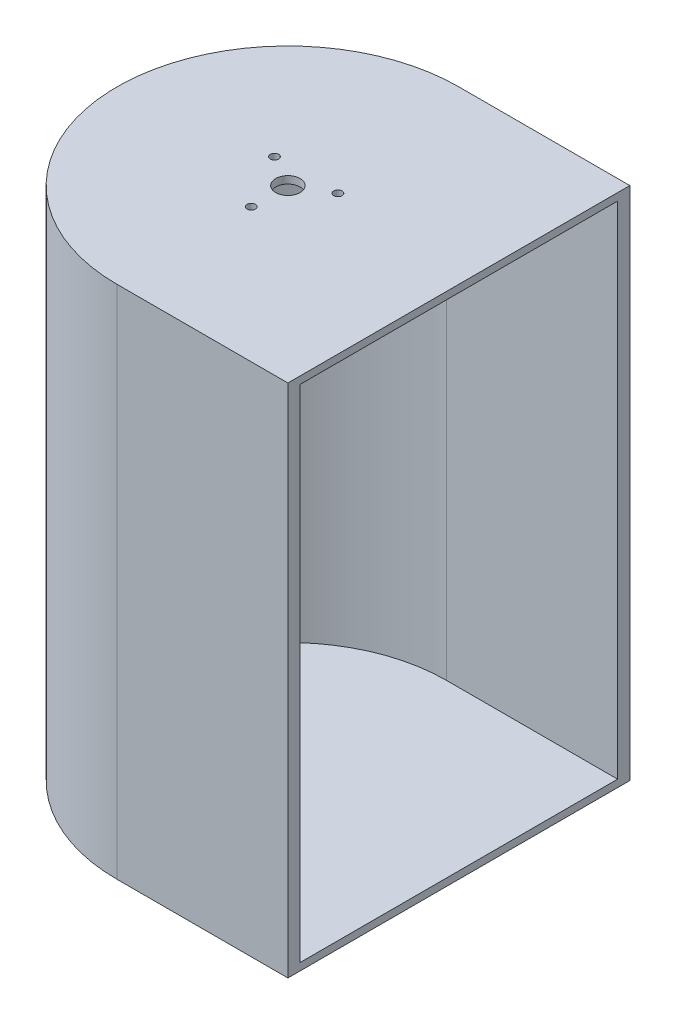
ISO-10303-21;
HEADER;
FILE_DESCRIPTION(('STEP AP214'),'2;1');
FILE_NAME('part.step','',(''),(''),'','','');
FILE_SCHEMA(('AUTOMOTIVE_DESIGN { 1 0 10303 214 1 1 1 1 }'));
ENDSEC;
DATA;
#1=APPLICATION_CONTEXT('core data for automotive mechanical design processes');
#2=APPLICATION_PROTOCOL_DEFINITION('international standard','automotive_design',2000,#1);
#3=PRODUCT_CONTEXT('',#1,'mechanical');
#4=PRODUCT('Part','Part','',(#3));
#5=PRODUCT_RELATED_PRODUCT_CATEGORY('part','',(#4));
#6=PRODUCT_DEFINITION_FORMATION('','',#4);
#7=PRODUCT_DEFINITION_CONTEXT('part definition',#1,'design');
#8=PRODUCT_DEFINITION('design','',#6,#7);
#9=PRODUCT_DEFINITION_SHAPE('','',#8);
#10=(LENGTH_UNIT() NAMED_UNIT(*) SI_UNIT(.MILLI.,.METRE.));
#11=(NAMED_UNIT(*) PLANE_ANGLE_UNIT() SI_UNIT($,.RADIAN.));
#12=(NAMED_UNIT(*) SI_UNIT($,.STERADIAN.) SOLID_ANGLE_UNIT());
#13=UNCERTAINTY_MEASURE_WITH_UNIT(LENGTH_MEASURE(1.E-05),#10,'distance_accuracy_value','');
#14=(GEOMETRIC_REPRESENTATION_CONTEXT(3) GLOBAL_UNCERTAINTY_ASSIGNED_CONTEXT((#13)) GLOBAL_UNIT_ASSIGNED_CONTEXT((#10,
#11,#12)) REPRESENTATION_CONTEXT('',''));
#15=CARTESIAN_POINT('',(0.,0.,0.));
#16=DIRECTION('',(0.,0.,1.));
#17=DIRECTION('',(1.,0.,0.));
#18=AXIS2_PLACEMENT_3D('',#15,#16,#17);
#19=CARTESIAN_POINT('',(0.,0.,0.));
#20=DIRECTION('',(0.,1.,0.));
#21=DIRECTION('',(0.,0.,1.));
#22=AXIS2_PLACEMENT_3D('',#19,#20,#21);
#23=PLANE('',#22);
#24=CARTESIAN_POINT('',(0.,0.,0.));
#25=DIRECTION('',(0.,1.,0.));
#26=DIRECTION('',(0.,0.,1.));
#27=AXIS2_PLACEMENT_3D('',#24,#25,#26);
#28=CIRCLE('',#27,5.);
#29=CARTESIAN_POINT('',(0.,0.,5.));
#30=VERTEX_POINT('',#29);
#31=EDGE_CURVE('E183',#30,#30,#28,.T.);
#32=ORIENTED_EDGE('',*,*,#31,.T.);
#33=EDGE_LOOP('',(#32));
#34=FACE_BOUND('',#33,.T.);
#35=CARTESIAN_POINT('',(0.,0.,15.));
#36=DIRECTION('',(0.,1.,0.));
#37=DIRECTION('',(0.,0.,1.));
#38=AXIS2_PLACEMENT_3D('',#35,#36,#37);
#39=CIRCLE('',#38,1.69999999999999);
#40=CARTESIAN_POINT('',(0.,0.,16.7));
#41=VERTEX_POINT('',#40);
#42=EDGE_CURVE('E177',#41,#41,#39,.F.);
#43=ORIENTED_EDGE('',*,*,#42,.F.);
#44=EDGE_LOOP('',(#43));
#45=FACE_BOUND('',#44,.T.);
#46=CARTESIAN_POINT('',(-12.9903810567675,0.,-7.49999999999945));
#47=DIRECTION('',(0.,1.,0.));
#48=DIRECTION('',(0.,0.,1.));
#49=AXIS2_PLACEMENT_3D('',#46,#47,#48);
#50=CIRCLE('',#49,1.69999999999999);
#51=CARTESIAN_POINT('',(-12.9903810567675,0.,-5.79999999999946));
#52=VERTEX_POINT('',#51);
#53=EDGE_CURVE('E171',#52,#52,#50,.F.);
#54=ORIENTED_EDGE('',*,*,#53,.F.);
#55=EDGE_LOOP('',(#54));
#56=FACE_BOUND('',#55,.T.);
#57=DIRECTION('',(0.,0.,1.));
#58=VECTOR('',#57,1.);
#59=CARTESIAN_POINT('',(70.,0.,65.));
#60=LINE('',#59,#58);
#61=CARTESIAN_POINT('',(70.,0.,-65.));
#62=VERTEX_POINT('',#61);
#63=CARTESIAN_POINT('',(70.,0.,65.));
#64=VERTEX_POINT('',#63);
#65=EDGE_CURVE('E56',#62,#64,#60,.T.);
#66=ORIENTED_EDGE('',*,*,#65,.T.);
#67=DIRECTION('',(-1.,0.,0.));
#68=VECTOR('',#67,1.);
#69=CARTESIAN_POINT('',(70.,0.,65.));
#70=LINE('',#69,#68);
#71=CARTESIAN_POINT('',(0.,0.,65.));
#72=VERTEX_POINT('',#71);
#73=EDGE_CURVE('E145',#64,#72,#70,.T.);
#74=ORIENTED_EDGE('',*,*,#73,.T.);
#75=CARTESIAN_POINT('',(0.,0.,0.));
#76=DIRECTION('',(0.,-1.,0.));
#77=DIRECTION('',(0.,0.,-1.));
#78=AXIS2_PLACEMENT_3D('',#75,#76,#77);
#79=CIRCLE('',#78,65.);
#80=CARTESIAN_POINT('',(0.,0.,-65.));
#81=VERTEX_POINT('',#80);
#82=EDGE_CURVE('E162',#72,#81,#79,.T.);
#83=ORIENTED_EDGE('',*,*,#82,.T.);
#84=DIRECTION('',(-1.,0.,0.));
#85=VECTOR('',#84,1.);
#86=CARTESIAN_POINT('',(70.,0.,-65.));
#87=LINE('',#86,#85);
#88=EDGE_CURVE('E148',#62,#81,#87,.T.);
#89=ORIENTED_EDGE('',*,*,#88,.F.);
#90=EDGE_LOOP('',(#66,#74,#83,#89));
#91=FACE_BOUND('',#90,.T.);
#92=CARTESIAN_POINT('',(12.9903810567656,0.,-7.50000000000055));
#93=DIRECTION('',(0.,1.,0.));
#94=DIRECTION('',(0.,0.,1.));
#95=AXIS2_PLACEMENT_3D('',#92,#93,#94);
#96=CIRCLE('',#95,1.69999999999999);
#97=CARTESIAN_POINT('',(12.9903810567656,0.,-5.80000000000056));
#98=VERTEX_POINT('',#97);
#99=EDGE_CURVE('E121',#98,#98,#96,.F.);
#100=ORIENTED_EDGE('',*,*,#99,.F.);
#101=EDGE_LOOP('',(#100));
#102=FACE_BOUND('',#101,.T.);
#103=ADVANCED_FACE('F39',(#34,#45,#56,#91,#102),#23,.F.);
#104=CARTESIAN_POINT('',(70.,0.,0.));
#105=DIRECTION('',(1.,0.,0.));
#106=DIRECTION('',(0.,0.,-1.));
#107=AXIS2_PLACEMENT_3D('',#104,#105,#106);
#108=PLANE('',#107);
#109=DIRECTION('',(0.,0.,-1.));
#110=VECTOR('',#109,1.);
#111=CARTESIAN_POINT('',(70.,-205.,-65.));
#112=LINE('',#111,#110);
#113=CARTESIAN_POINT('',(70.,-205.,65.));
#114=VERTEX_POINT('',#113);
#115=CARTESIAN_POINT('',(70.,-205.,-65.));
#116=VERTEX_POINT('',#115);
#117=EDGE_CURVE('E11',#114,#116,#112,.T.);
#118=ORIENTED_EDGE('',*,*,#117,.F.);
#119=DIRECTION('',(0.,-1.,0.));
#120=VECTOR('',#119,1.);
#121=CARTESIAN_POINT('',(70.,0.,65.));
#122=LINE('',#121,#120);
#123=EDGE_CURVE('E137',#64,#114,#122,.T.);
#124=ORIENTED_EDGE('',*,*,#123,.F.);
#125=ORIENTED_EDGE('',*,*,#65,.F.);
#126=DIRECTION('',(0.,1.,0.));
#127=VECTOR('',#126,1.);
#128=CARTESIAN_POINT('',(70.,-205.,-65.));
#129=LINE('',#128,#127);
#130=EDGE_CURVE('E48',#116,#62,#129,.T.);
#131=ORIENTED_EDGE('',*,*,#130,.F.);
#132=EDGE_LOOP('',(#118,#124,#125,#131));
#133=FACE_BOUND('',#132,.T.);
#134=DIRECTION('',(0.,0.,1.));
#135=VECTOR('',#134,1.);
#136=CARTESIAN_POINT('',(70.,-208.,0.));
#137=LINE('',#136,#135);
#138=CARTESIAN_POINT('',(70.,-208.,-70.));
#139=VERTEX_POINT('',#138);
#140=CARTESIAN_POINT('',(70.,-208.,70.));
#141=VERTEX_POINT('',#140);
#142=EDGE_CURVE('E104',#139,#141,#137,.T.);
#143=ORIENTED_EDGE('',*,*,#142,.F.);
#144=DIRECTION('',(0.,1.,0.));
#145=VECTOR('',#144,1.);
#146=CARTESIAN_POINT('',(70.,-208.,-70.));
#147=LINE('',#146,#145);
#148=CARTESIAN_POINT('',(70.,3.,-70.));
#149=VERTEX_POINT('',#148);
#150=EDGE_CURVE('E114',#139,#149,#147,.T.);
#151=ORIENTED_EDGE('',*,*,#150,.T.);
#152=DIRECTION('',(0.,0.,-1.));
#153=VECTOR('',#152,1.);
#154=CARTESIAN_POINT('',(70.,3.,0.));
#155=LINE('',#154,#153);
#156=CARTESIAN_POINT('',(70.,3.,70.));
#157=VERTEX_POINT('',#156);
#158=EDGE_CURVE('E113',#157,#149,#155,.T.);
#159=ORIENTED_EDGE('',*,*,#158,.F.);
#160=DIRECTION('',(0.,-1.,0.));
#161=VECTOR('',#160,1.);
#162=CARTESIAN_POINT('',(70.,3.,70.));
#163=LINE('',#162,#161);
#164=EDGE_CURVE('E117',#157,#141,#163,.T.);
#165=ORIENTED_EDGE('',*,*,#164,.T.);
#166=EDGE_LOOP('',(#143,#151,#159,#165));
#167=FACE_BOUND('',#166,.T.);
#168=ADVANCED_FACE('F118',(#133,#167),#108,.T.);
#169=CARTESIAN_POINT('',(0.,3.,0.));
#170=DIRECTION('',(0.,-1.,0.));
#171=DIRECTION('',(0.,0.,-1.));
#172=AXIS2_PLACEMENT_3D('',#169,#170,#171);
#173=CYLINDRICAL_SURFACE('',#172,70.);
#174=DIRECTION('',(0.,-1.,0.));
#175=VECTOR('',#174,1.);
#176=CARTESIAN_POINT('',(0.,3.,70.));
#177=LINE('',#176,#175);
#178=CARTESIAN_POINT('',(0.,3.,70.));
#179=VERTEX_POINT('',#178);
#180=CARTESIAN_POINT('',(0.,-208.,70.));
#181=VERTEX_POINT('',#180);
#182=EDGE_CURVE('E125',#179,#181,#177,.T.);
#183=ORIENTED_EDGE('',*,*,#182,.F.);
#184=CARTESIAN_POINT('',(0.,3.,0.));
#185=DIRECTION('',(0.,1.,0.));
#186=DIRECTION('',(0.,0.,1.));
#187=AXIS2_PLACEMENT_3D('',#184,#185,#186);
#188=CIRCLE('',#187,70.);
#189=CARTESIAN_POINT('',(0.,3.,-70.));
#190=VERTEX_POINT('',#189);
#191=EDGE_CURVE('E155',#190,#179,#188,.T.);
#192=ORIENTED_EDGE('',*,*,#191,.F.);
#193=DIRECTION('',(0.,-1.,0.));
#194=VECTOR('',#193,1.);
#195=CARTESIAN_POINT('',(0.,3.,-70.));
#196=LINE('',#195,#194);
#197=CARTESIAN_POINT('',(0.,-208.,-70.));
#198=VERTEX_POINT('',#197);
#199=EDGE_CURVE('E132',#198,#190,#196,.F.);
#200=ORIENTED_EDGE('',*,*,#199,.F.);
#201=CARTESIAN_POINT('',(0.,-208.,0.));
#202=DIRECTION('',(0.,-1.,0.));
#203=DIRECTION('',(0.,0.,-1.));
#204=AXIS2_PLACEMENT_3D('',#201,#202,#203);
#205=CIRCLE('',#204,70.);
#206=EDGE_CURVE('E136',#181,#198,#205,.T.);
#207=ORIENTED_EDGE('',*,*,#206,.F.);
#208=EDGE_LOOP('',(#183,#192,#200,#207));
#209=FACE_BOUND('',#208,.T.);
#210=ADVANCED_FACE('F206',(#209),#173,.T.);
#211=CARTESIAN_POINT('',(70.,-208.,-70.));
#212=DIRECTION('',(0.,0.,1.));
#213=DIRECTION('',(1.,0.,0.));
#214=AXIS2_PLACEMENT_3D('',#211,#212,#213);
#215=PLANE('',#214);
#216=ORIENTED_EDGE('',*,*,#150,.F.);
#217=DIRECTION('',(-1.,0.,0.));
#218=VECTOR('',#217,1.);
#219=CARTESIAN_POINT('',(70.,-208.,-70.));
#220=LINE('',#219,#218);
#221=EDGE_CURVE('E43',#139,#198,#220,.T.);
#222=ORIENTED_EDGE('',*,*,#221,.T.);
#223=ORIENTED_EDGE('',*,*,#199,.T.);
#224=DIRECTION('',(-1.,0.,0.));
#225=VECTOR('',#224,1.);
#226=CARTESIAN_POINT('',(70.,3.,-70.));
#227=LINE('',#226,#225);
#228=EDGE_CURVE('E129',#149,#190,#227,.T.);
#229=ORIENTED_EDGE('',*,*,#228,.F.);
#230=EDGE_LOOP('',(#216,#222,#223,#229));
#231=FACE_BOUND('',#230,.T.);
#232=ADVANCED_FACE('F210',(#231),#215,.F.);
#233=CARTESIAN_POINT('',(70.,3.,70.));
#234=DIRECTION('',(0.,0.,-1.));
#235=DIRECTION('',(-1.,0.,0.));
#236=AXIS2_PLACEMENT_3D('',#233,#234,#235);
#237=PLANE('',#236);
#238=ORIENTED_EDGE('',*,*,#164,.F.);
#239=DIRECTION('',(-1.,0.,0.));
#240=VECTOR('',#239,1.);
#241=CARTESIAN_POINT('',(70.,3.,70.));
#242=LINE('',#241,#240);
#243=EDGE_CURVE('E127',#157,#179,#242,.T.);
#244=ORIENTED_EDGE('',*,*,#243,.T.);
#245=ORIENTED_EDGE('',*,*,#182,.T.);
#246=DIRECTION('',(-1.,0.,0.));
#247=VECTOR('',#246,1.);
#248=CARTESIAN_POINT('',(70.,-208.,70.));
#249=LINE('',#248,#247);
#250=EDGE_CURVE('E108',#141,#181,#249,.T.);
#251=ORIENTED_EDGE('',*,*,#250,.F.);
#252=EDGE_LOOP('',(#238,#244,#245,#251));
#253=FACE_BOUND('',#252,.T.);
#254=ADVANCED_FACE('F123',(#253),#237,.F.);
#255=CARTESIAN_POINT('',(0.,3.,0.));
#256=DIRECTION('',(0.,1.,0.));
#257=DIRECTION('',(0.,0.,1.));
#258=AXIS2_PLACEMENT_3D('',#255,#256,#257);
#259=PLANE('',#258);
#260=CARTESIAN_POINT('',(0.,3.,0.));
#261=DIRECTION('',(0.,1.,0.));
#262=DIRECTION('',(0.,0.,1.));
#263=AXIS2_PLACEMENT_3D('',#260,#261,#262);
#264=CIRCLE('',#263,5.);
#265=CARTESIAN_POINT('',(0.,3.,5.));
#266=VERTEX_POINT('',#265);
#267=EDGE_CURVE('E188',#266,#266,#264,.T.);
#268=ORIENTED_EDGE('',*,*,#267,.F.);
#269=EDGE_LOOP('',(#268));
#270=FACE_BOUND('',#269,.T.);
#271=CARTESIAN_POINT('',(0.,3.,15.));
#272=DIRECTION('',(0.,1.,0.));
#273=DIRECTION('',(0.,0.,1.));
#274=AXIS2_PLACEMENT_3D('',#271,#272,#273);
#275=CIRCLE('',#274,1.69999999999999);
#276=CARTESIAN_POINT('',(0.,3.,16.7));
#277=VERTEX_POINT('',#276);
#278=EDGE_CURVE('E180',#277,#277,#275,.T.);
#279=ORIENTED_EDGE('',*,*,#278,.F.);
#280=EDGE_LOOP('',(#279));
#281=FACE_BOUND('',#280,.T.);
#282=CARTESIAN_POINT('',(-12.9903810567675,3.,-7.49999999999945));
#283=DIRECTION('',(0.,1.,0.));
#284=DIRECTION('',(0.,0.,1.));
#285=AXIS2_PLACEMENT_3D('',#282,#283,#284);
#286=CIRCLE('',#285,1.69999999999999);
#287=CARTESIAN_POINT('',(-12.9903810567675,3.,-5.79999999999946));
#288=VERTEX_POINT('',#287);
#289=EDGE_CURVE('E174',#288,#288,#286,.T.);
#290=ORIENTED_EDGE('',*,*,#289,.F.);
#291=EDGE_LOOP('',(#290));
#292=FACE_BOUND('',#291,.T.);
#293=CARTESIAN_POINT('',(12.9903810567656,3.,-7.50000000000055));
#294=DIRECTION('',(0.,1.,0.));
#295=DIRECTION('',(0.,0.,1.));
#296=AXIS2_PLACEMENT_3D('',#293,#294,#295);
#297=CIRCLE('',#296,1.69999999999999);
#298=CARTESIAN_POINT('',(12.9903810567656,3.,-5.80000000000056));
#299=VERTEX_POINT('',#298);
#300=EDGE_CURVE('E168',#299,#299,#297,.T.);
#301=ORIENTED_EDGE('',*,*,#300,.F.);
#302=EDGE_LOOP('',(#301));
#303=FACE_BOUND('',#302,.T.);
#304=ORIENTED_EDGE('',*,*,#243,.F.);
#305=ORIENTED_EDGE('',*,*,#158,.T.);
#306=ORIENTED_EDGE('',*,*,#228,.T.);
#307=ORIENTED_EDGE('',*,*,#191,.T.);
#308=EDGE_LOOP('',(#304,#305,#306,#307));
#309=FACE_BOUND('',#308,.T.);
#310=ADVANCED_FACE('F195',(#270,#281,#292,#303,#309),#259,.T.);
#311=CARTESIAN_POINT('',(0.,-208.,0.));
#312=DIRECTION('',(0.,-1.,0.));
#313=DIRECTION('',(0.,0.,-1.));
#314=AXIS2_PLACEMENT_3D('',#311,#312,#313);
#315=PLANE('',#314);
#316=ORIENTED_EDGE('',*,*,#221,.F.);
#317=ORIENTED_EDGE('',*,*,#142,.T.);
#318=ORIENTED_EDGE('',*,*,#250,.T.);
#319=ORIENTED_EDGE('',*,*,#206,.T.);
#320=EDGE_LOOP('',(#316,#317,#318,#319));
#321=FACE_BOUND('',#320,.T.);
#322=ADVANCED_FACE('F41',(#321),#315,.T.);
#323=CARTESIAN_POINT('',(0.,-205.,0.));
#324=DIRECTION('',(0.,-1.,0.));
#325=DIRECTION('',(0.,0.,-1.));
#326=AXIS2_PLACEMENT_3D('',#323,#324,#325);
#327=PLANE('',#326);
#328=ORIENTED_EDGE('',*,*,#117,.T.);
#329=DIRECTION('',(-1.,0.,0.));
#330=VECTOR('',#329,1.);
#331=CARTESIAN_POINT('',(70.,-205.,-65.));
#332=LINE('',#331,#330);
#333=CARTESIAN_POINT('',(0.,-205.,-65.));
#334=VERTEX_POINT('',#333);
#335=EDGE_CURVE('E128',#116,#334,#332,.T.);
#336=ORIENTED_EDGE('',*,*,#335,.T.);
#337=CARTESIAN_POINT('',(0.,-205.,0.));
#338=DIRECTION('',(0.,-1.,0.));
#339=DIRECTION('',(0.,0.,-1.));
#340=AXIS2_PLACEMENT_3D('',#337,#338,#339);
#341=CIRCLE('',#340,65.);
#342=CARTESIAN_POINT('',(0.,-205.,65.));
#343=VERTEX_POINT('',#342);
#344=EDGE_CURVE('E165',#343,#334,#341,.T.);
#345=ORIENTED_EDGE('',*,*,#344,.F.);
#346=DIRECTION('',(-1.,0.,0.));
#347=VECTOR('',#346,1.);
#348=CARTESIAN_POINT('',(70.,-205.,65.));
#349=LINE('',#348,#347);
#350=EDGE_CURVE('E142',#114,#343,#349,.T.);
#351=ORIENTED_EDGE('',*,*,#350,.F.);
#352=EDGE_LOOP('',(#328,#336,#345,#351));
#353=FACE_BOUND('',#352,.T.);
#354=ADVANCED_FACE('F223',(#353),#327,.F.);
#355=CARTESIAN_POINT('',(0.,-205.,0.));
#356=DIRECTION('',(0.,1.,0.));
#357=DIRECTION('',(0.,0.,1.));
#358=AXIS2_PLACEMENT_3D('',#355,#356,#357);
#359=CYLINDRICAL_SURFACE('',#358,65.);
#360=ORIENTED_EDGE('',*,*,#344,.T.);
#361=DIRECTION('',(0.,1.,0.));
#362=VECTOR('',#361,1.);
#363=CARTESIAN_POINT('',(0.,-205.,-65.));
#364=LINE('',#363,#362);
#365=EDGE_CURVE('E154',#334,#81,#364,.T.);
#366=ORIENTED_EDGE('',*,*,#365,.T.);
#367=ORIENTED_EDGE('',*,*,#82,.F.);
#368=DIRECTION('',(0.,1.,0.));
#369=VECTOR('',#368,1.);
#370=CARTESIAN_POINT('',(0.,-205.,65.));
#371=LINE('',#370,#369);
#372=EDGE_CURVE('E152',#72,#343,#371,.F.);
#373=ORIENTED_EDGE('',*,*,#372,.T.);
#374=EDGE_LOOP('',(#360,#366,#367,#373));
#375=FACE_BOUND('',#374,.T.);
#376=ADVANCED_FACE('F233',(#375),#359,.F.);
#377=CARTESIAN_POINT('',(70.,0.,65.));
#378=DIRECTION('',(0.,0.,-1.));
#379=DIRECTION('',(-1.,0.,0.));
#380=AXIS2_PLACEMENT_3D('',#377,#378,#379);
#381=PLANE('',#380);
#382=ORIENTED_EDGE('',*,*,#372,.F.);
#383=ORIENTED_EDGE('',*,*,#73,.F.);
#384=ORIENTED_EDGE('',*,*,#123,.T.);
#385=ORIENTED_EDGE('',*,*,#350,.T.);
#386=EDGE_LOOP('',(#382,#383,#384,#385));
#387=FACE_BOUND('',#386,.T.);
#388=ADVANCED_FACE('F238',(#387),#381,.T.);
#389=CARTESIAN_POINT('',(70.,-205.,-65.));
#390=DIRECTION('',(0.,0.,1.));
#391=DIRECTION('',(1.,0.,0.));
#392=AXIS2_PLACEMENT_3D('',#389,#390,#391);
#393=PLANE('',#392);
#394=ORIENTED_EDGE('',*,*,#365,.F.);
#395=ORIENTED_EDGE('',*,*,#335,.F.);
#396=ORIENTED_EDGE('',*,*,#130,.T.);
#397=ORIENTED_EDGE('',*,*,#88,.T.);
#398=EDGE_LOOP('',(#394,#395,#396,#397));
#399=FACE_BOUND('',#398,.T.);
#400=ADVANCED_FACE('F219',(#399),#393,.T.);
#401=CARTESIAN_POINT('',(12.9903810567656,3.,-7.50000000000055));
#402=DIRECTION('',(0.,1.,0.));
#403=DIRECTION('',(0.,0.,1.));
#404=AXIS2_PLACEMENT_3D('',#401,#402,#403);
#405=CYLINDRICAL_SURFACE('',#404,1.69999999999999);
#406=ORIENTED_EDGE('',*,*,#99,.T.);
#407=EDGE_LOOP('',(#406));
#408=FACE_BOUND('',#407,.T.);
#409=ORIENTED_EDGE('',*,*,#300,.T.);
#410=EDGE_LOOP('',(#409));
#411=FACE_BOUND('',#410,.T.);
#412=ADVANCED_FACE('F229',(#408,#411),#405,.F.);
#413=CARTESIAN_POINT('',(-12.9903810567675,3.,-7.49999999999945));
#414=DIRECTION('',(0.,1.,0.));
#415=DIRECTION('',(0.,0.,1.));
#416=AXIS2_PLACEMENT_3D('',#413,#414,#415);
#417=CYLINDRICAL_SURFACE('',#416,1.69999999999999);
#418=ORIENTED_EDGE('',*,*,#53,.T.);
#419=EDGE_LOOP('',(#418));
#420=FACE_BOUND('',#419,.T.);
#421=ORIENTED_EDGE('',*,*,#289,.T.);
#422=EDGE_LOOP('',(#421));
#423=FACE_BOUND('',#422,.T.);
#424=ADVANCED_FACE('F250',(#420,#423),#417,.F.);
#425=CARTESIAN_POINT('',(0.,3.,15.));
#426=DIRECTION('',(0.,1.,0.));
#427=DIRECTION('',(0.,0.,1.));
#428=AXIS2_PLACEMENT_3D('',#425,#426,#427);
#429=CYLINDRICAL_SURFACE('',#428,1.69999999999999);
#430=ORIENTED_EDGE('',*,*,#42,.T.);
#431=EDGE_LOOP('',(#430));
#432=FACE_BOUND('',#431,.T.);
#433=ORIENTED_EDGE('',*,*,#278,.T.);
#434=EDGE_LOOP('',(#433));
#435=FACE_BOUND('',#434,.T.);
#436=ADVANCED_FACE('F254',(#432,#435),#429,.F.);
#437=CARTESIAN_POINT('',(0.,-7.,0.));
#438=DIRECTION('',(0.,1.,0.));
#439=DIRECTION('',(0.,0.,1.));
#440=AXIS2_PLACEMENT_3D('',#437,#438,#439);
#441=CYLINDRICAL_SURFACE('',#440,5.);
#442=ORIENTED_EDGE('',*,*,#267,.T.);
#443=EDGE_LOOP('',(#442));
#444=FACE_BOUND('',#443,.T.);
#445=ORIENTED_EDGE('',*,*,#31,.F.);
#446=EDGE_LOOP('',(#445));
#447=FACE_BOUND('',#446,.T.);
#448=ADVANCED_FACE('F192',(#444,#447),#441,.F.);
#449=CLOSED_SHELL('',(#103,#168,#210,#232,#254,#310,#322,#354,#376,#388,#400,#412,#424,#436,#448));
#450=MANIFOLD_SOLID_BREP('B2',#449);
#451=ADVANCED_BREP_SHAPE_REPRESENTATION('',(#18,#450),#14);
#452=SHAPE_DEFINITION_REPRESENTATION(#9,#451);
ENDSEC;
END-ISO-10303-21;
